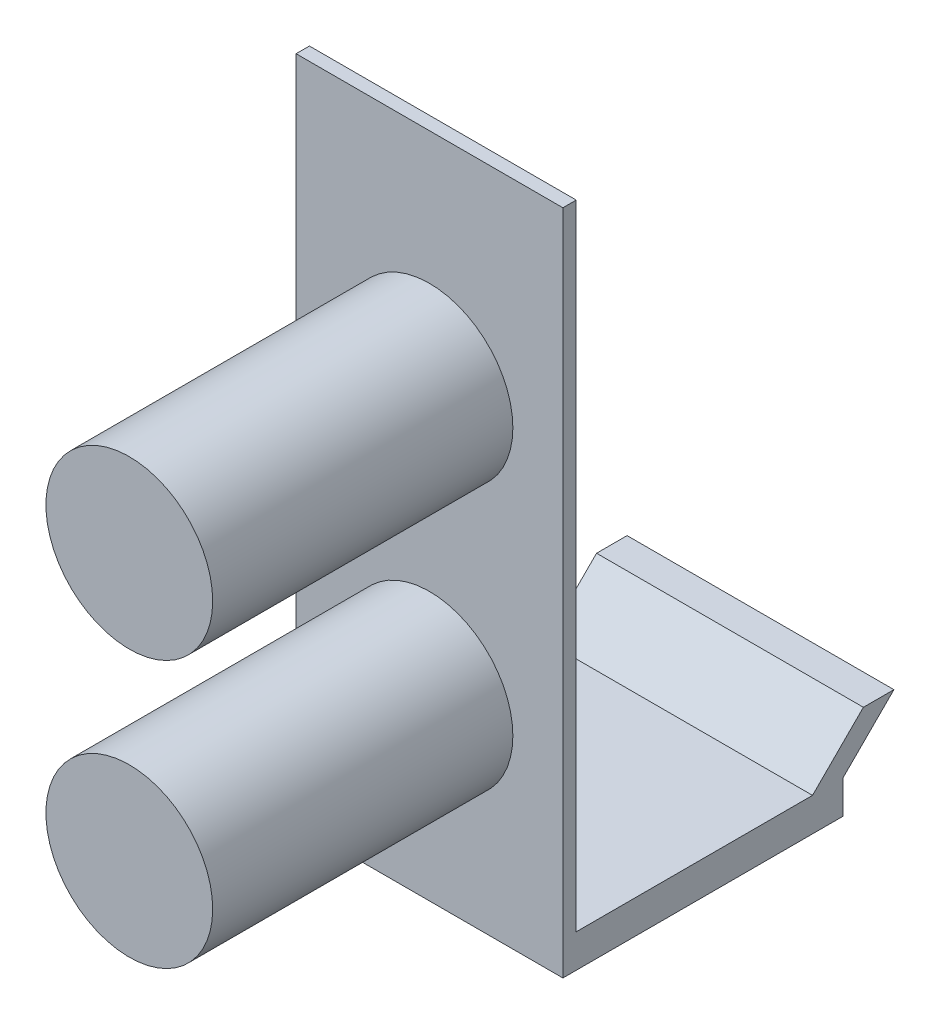
ISO-10303-21;
HEADER;
FILE_DESCRIPTION(('STEP AP214'),'2;1');
FILE_NAME('part.step','',(''),(''),'','','');
FILE_SCHEMA(('AUTOMOTIVE_DESIGN { 1 0 10303 214 1 1 1 1 }'));
ENDSEC;
DATA;
#1=APPLICATION_CONTEXT('core data for automotive mechanical design processes');
#2=APPLICATION_PROTOCOL_DEFINITION('international standard','automotive_design',2000,#1);
#3=PRODUCT_CONTEXT('',#1,'mechanical');
#4=PRODUCT('Part','Part','',(#3));
#5=PRODUCT_RELATED_PRODUCT_CATEGORY('part','',(#4));
#6=PRODUCT_DEFINITION_FORMATION('','',#4);
#7=PRODUCT_DEFINITION_CONTEXT('part definition',#1,'design');
#8=PRODUCT_DEFINITION('design','',#6,#7);
#9=PRODUCT_DEFINITION_SHAPE('','',#8);
#10=(LENGTH_UNIT() NAMED_UNIT(*) SI_UNIT(.MILLI.,.METRE.));
#11=(NAMED_UNIT(*) PLANE_ANGLE_UNIT() SI_UNIT($,.RADIAN.));
#12=(NAMED_UNIT(*) SI_UNIT($,.STERADIAN.) SOLID_ANGLE_UNIT());
#13=UNCERTAINTY_MEASURE_WITH_UNIT(LENGTH_MEASURE(1.E-05),#10,'distance_accuracy_value','');
#14=(GEOMETRIC_REPRESENTATION_CONTEXT(3) GLOBAL_UNCERTAINTY_ASSIGNED_CONTEXT((#13)) GLOBAL_UNIT_ASSIGNED_CONTEXT((#10,
#11,#12)) REPRESENTATION_CONTEXT('',''));
#15=CARTESIAN_POINT('',(0.,0.,0.));
#16=DIRECTION('',(0.,0.,1.));
#17=DIRECTION('',(1.,0.,0.));
#18=AXIS2_PLACEMENT_3D('',#15,#16,#17);
#19=CARTESIAN_POINT('',(0.,0.,0.));
#20=DIRECTION('',(0.,0.,1.));
#21=DIRECTION('',(1.,0.,0.));
#22=AXIS2_PLACEMENT_3D('',#19,#20,#21);
#23=PLANE('',#22);
#24=DIRECTION('',(1.,0.,0.));
#25=VECTOR('',#24,1.);
#26=CARTESIAN_POINT('',(25.4,-57.15,0.));
#27=LINE('',#26,#25);
#28=CARTESIAN_POINT('',(-25.4,-57.15,0.));
#29=VERTEX_POINT('',#28);
#30=CARTESIAN_POINT('',(25.4,-57.15,0.));
#31=VERTEX_POINT('',#30);
#32=EDGE_CURVE('E157',#29,#31,#27,.T.);
#33=ORIENTED_EDGE('',*,*,#32,.F.);
#34=DIRECTION('',(0.,-1.,0.));
#35=VECTOR('',#34,1.);
#36=CARTESIAN_POINT('',(-25.4,63.5,0.));
#37=LINE('',#36,#35);
#38=CARTESIAN_POINT('',(-25.4,63.5,0.));
#39=VERTEX_POINT('',#38);
#40=EDGE_CURVE('E199',#39,#29,#37,.T.);
#41=ORIENTED_EDGE('',*,*,#40,.F.);
#42=DIRECTION('',(-1.,0.,0.));
#43=VECTOR('',#42,1.);
#44=CARTESIAN_POINT('',(-25.4,63.5,0.));
#45=LINE('',#44,#43);
#46=CARTESIAN_POINT('',(25.4,63.5,0.));
#47=VERTEX_POINT('',#46);
#48=EDGE_CURVE('E79',#47,#39,#45,.T.);
#49=ORIENTED_EDGE('',*,*,#48,.F.);
#50=DIRECTION('',(0.,1.,0.));
#51=VECTOR('',#50,1.);
#52=CARTESIAN_POINT('',(25.4,63.5,0.));
#53=LINE('',#52,#51);
#54=EDGE_CURVE('E191',#31,#47,#53,.T.);
#55=ORIENTED_EDGE('',*,*,#54,.F.);
#56=EDGE_LOOP('',(#33,#41,#49,#55));
#57=FACE_BOUND('',#56,.T.);
#58=ADVANCED_FACE('F39',(#57),#23,.F.);
#59=CARTESIAN_POINT('',(25.4,63.5,2.54));
#60=DIRECTION('',(-1.,0.,0.));
#61=DIRECTION('',(0.,-1.,0.));
#62=AXIS2_PLACEMENT_3D('',#59,#60,#61);
#63=PLANE('',#62);
#64=DIRECTION('',(0.,-1.,0.));
#65=VECTOR('',#64,1.);
#66=CARTESIAN_POINT('',(25.4,-57.15,-50.8));
#67=LINE('',#66,#65);
#68=CARTESIAN_POINT('',(25.4,-57.15,-50.8));
#69=VERTEX_POINT('',#68);
#70=CARTESIAN_POINT('',(25.4,-63.5,-50.8));
#71=VERTEX_POINT('',#70);
#72=EDGE_CURVE('E127',#69,#71,#67,.T.);
#73=ORIENTED_EDGE('',*,*,#72,.F.);
#74=DIRECTION('',(0.,0.707106781186551,-0.707106781186544));
#75=VECTOR('',#74,1.);
#76=CARTESIAN_POINT('',(25.4,-63.5,-44.4500000000001));
#77=LINE('',#76,#75);
#78=CARTESIAN_POINT('',(25.4,-47.4678821923336,-60.4821178076663));
#79=VERTEX_POINT('',#78);
#80=EDGE_CURVE('E120',#69,#79,#77,.T.);
#81=ORIENTED_EDGE('',*,*,#80,.T.);
#82=DIRECTION('',(0.,0.,1.));
#83=VECTOR('',#82,1.);
#84=CARTESIAN_POINT('',(25.4,-47.4678821923336,-60.4821178076663));
#85=LINE('',#84,#83);
#86=CARTESIAN_POINT('',(25.4,-47.4678821923336,-54.6677736900544));
#87=VERTEX_POINT('',#86);
#88=EDGE_CURVE('E124',#79,#87,#85,.T.);
#89=ORIENTED_EDGE('',*,*,#88,.T.);
#90=DIRECTION('',(0.,-0.707106781186551,0.707106781186544));
#91=VECTOR('',#90,1.);
#92=CARTESIAN_POINT('',(25.4,-63.5,-38.6356558823882));
#93=LINE('',#92,#91);
#94=CARTESIAN_POINT('',(25.4,-57.15,-44.9856558823881));
#95=VERTEX_POINT('',#94);
#96=EDGE_CURVE('E142',#87,#95,#93,.T.);
#97=ORIENTED_EDGE('',*,*,#96,.T.);
#98=DIRECTION('',(0.,0.,1.));
#99=VECTOR('',#98,1.);
#100=CARTESIAN_POINT('',(25.4,-57.15,-50.8));
#101=LINE('',#100,#99);
#102=EDGE_CURVE('E172',#95,#31,#101,.T.);
#103=ORIENTED_EDGE('',*,*,#102,.T.);
#104=ORIENTED_EDGE('',*,*,#54,.T.);
#105=DIRECTION('',(0.,0.,-1.));
#106=VECTOR('',#105,1.);
#107=CARTESIAN_POINT('',(25.4,63.5,2.54));
#108=LINE('',#107,#106);
#109=CARTESIAN_POINT('',(25.4,63.5,2.54));
#110=VERTEX_POINT('',#109);
#111=EDGE_CURVE('E195',#110,#47,#108,.T.);
#112=ORIENTED_EDGE('',*,*,#111,.F.);
#113=DIRECTION('',(0.,1.,0.));
#114=VECTOR('',#113,1.);
#115=CARTESIAN_POINT('',(25.4,63.5,2.54));
#116=LINE('',#115,#114);
#117=CARTESIAN_POINT('',(25.4,-63.5,2.54));
#118=VERTEX_POINT('',#117);
#119=EDGE_CURVE('E196',#118,#110,#116,.T.);
#120=ORIENTED_EDGE('',*,*,#119,.F.);
#121=DIRECTION('',(0.,0.,-1.));
#122=VECTOR('',#121,1.);
#123=CARTESIAN_POINT('',(25.4,-63.5,2.54));
#124=LINE('',#123,#122);
#125=EDGE_CURVE('E207',#118,#71,#124,.T.);
#126=ORIENTED_EDGE('',*,*,#125,.T.);
#127=EDGE_LOOP('',(#73,#81,#89,#97,#103,#104,#112,#120,#126));
#128=FACE_BOUND('',#127,.T.);
#129=ADVANCED_FACE('F41',(#128),#63,.F.);
#130=CARTESIAN_POINT('',(-25.4,63.5,2.54));
#131=DIRECTION('',(0.,-1.,0.));
#132=DIRECTION('',(0.,0.,-1.));
#133=AXIS2_PLACEMENT_3D('',#130,#131,#132);
#134=PLANE('',#133);
#135=ORIENTED_EDGE('',*,*,#48,.T.);
#136=DIRECTION('',(0.,0.,-1.));
#137=VECTOR('',#136,1.);
#138=CARTESIAN_POINT('',(-25.4,63.5,2.54));
#139=LINE('',#138,#137);
#140=CARTESIAN_POINT('',(-25.4,63.5,2.54));
#141=VERTEX_POINT('',#140);
#142=EDGE_CURVE('E220',#141,#39,#139,.T.);
#143=ORIENTED_EDGE('',*,*,#142,.F.);
#144=DIRECTION('',(-1.,0.,0.));
#145=VECTOR('',#144,1.);
#146=CARTESIAN_POINT('',(-25.4,63.5,2.54));
#147=LINE('',#146,#145);
#148=EDGE_CURVE('E84',#110,#141,#147,.T.);
#149=ORIENTED_EDGE('',*,*,#148,.F.);
#150=ORIENTED_EDGE('',*,*,#111,.T.);
#151=EDGE_LOOP('',(#135,#143,#149,#150));
#152=FACE_BOUND('',#151,.T.);
#153=ADVANCED_FACE('F224',(#152),#134,.F.);
#154=CARTESIAN_POINT('',(-25.4,63.5,2.54));
#155=DIRECTION('',(1.,0.,0.));
#156=DIRECTION('',(0.,1.,0.));
#157=AXIS2_PLACEMENT_3D('',#154,#155,#156);
#158=PLANE('',#157);
#159=DIRECTION('',(0.,1.,0.));
#160=VECTOR('',#159,1.);
#161=CARTESIAN_POINT('',(-25.4,-57.15,-50.8));
#162=LINE('',#161,#160);
#163=CARTESIAN_POINT('',(-25.4,-63.5,-50.8));
#164=VERTEX_POINT('',#163);
#165=CARTESIAN_POINT('',(-25.4,-57.1500000000001,-50.8));
#166=VERTEX_POINT('',#165);
#167=EDGE_CURVE('E159',#164,#166,#162,.T.);
#168=ORIENTED_EDGE('',*,*,#167,.F.);
#169=DIRECTION('',(0.,0.,-1.));
#170=VECTOR('',#169,1.);
#171=CARTESIAN_POINT('',(-25.4,-63.5,2.54));
#172=LINE('',#171,#170);
#173=CARTESIAN_POINT('',(-25.4,-63.5,2.54));
#174=VERTEX_POINT('',#173);
#175=EDGE_CURVE('E217',#174,#164,#172,.T.);
#176=ORIENTED_EDGE('',*,*,#175,.F.);
#177=DIRECTION('',(0.,-1.,0.));
#178=VECTOR('',#177,1.);
#179=CARTESIAN_POINT('',(-25.4,63.5,2.54));
#180=LINE('',#179,#178);
#181=EDGE_CURVE('E202',#141,#174,#180,.T.);
#182=ORIENTED_EDGE('',*,*,#181,.F.);
#183=ORIENTED_EDGE('',*,*,#142,.T.);
#184=ORIENTED_EDGE('',*,*,#40,.T.);
#185=DIRECTION('',(0.,0.,1.));
#186=VECTOR('',#185,1.);
#187=CARTESIAN_POINT('',(-25.4,-57.15,-50.8));
#188=LINE('',#187,#186);
#189=CARTESIAN_POINT('',(-25.4,-57.15,-44.9856558823882));
#190=VERTEX_POINT('',#189);
#191=EDGE_CURVE('E54',#190,#29,#188,.T.);
#192=ORIENTED_EDGE('',*,*,#191,.F.);
#193=DIRECTION('',(0.,0.707106781186551,-0.707106781186544));
#194=VECTOR('',#193,1.);
#195=CARTESIAN_POINT('',(-25.4,-63.5,-38.6356558823882));
#196=LINE('',#195,#194);
#197=CARTESIAN_POINT('',(-25.4,-47.4678821923336,-54.6677736900544));
#198=VERTEX_POINT('',#197);
#199=EDGE_CURVE('E158',#190,#198,#196,.T.);
#200=ORIENTED_EDGE('',*,*,#199,.T.);
#201=DIRECTION('',(0.,0.,-1.));
#202=VECTOR('',#201,1.);
#203=CARTESIAN_POINT('',(-25.4,-47.4678821923336,-60.4821178076663));
#204=LINE('',#203,#202);
#205=CARTESIAN_POINT('',(-25.4,-47.4678821923336,-60.4821178076663));
#206=VERTEX_POINT('',#205);
#207=EDGE_CURVE('E153',#198,#206,#204,.T.);
#208=ORIENTED_EDGE('',*,*,#207,.T.);
#209=DIRECTION('',(0.,-0.707106781186551,0.707106781186544));
#210=VECTOR('',#209,1.);
#211=CARTESIAN_POINT('',(-25.4,-63.5,-44.4500000000001));
#212=LINE('',#211,#210);
#213=EDGE_CURVE('E137',#206,#166,#212,.T.);
#214=ORIENTED_EDGE('',*,*,#213,.T.);
#215=EDGE_LOOP('',(#168,#176,#182,#183,#184,#192,#200,#208,#214));
#216=FACE_BOUND('',#215,.T.);
#217=ADVANCED_FACE('F232',(#216),#158,.F.);
#218=CARTESIAN_POINT('',(-25.4,-63.5,2.54));
#219=DIRECTION('',(0.,1.,0.));
#220=DIRECTION('',(0.,0.,1.));
#221=AXIS2_PLACEMENT_3D('',#218,#219,#220);
#222=PLANE('',#221);
#223=DIRECTION('',(-1.,0.,0.));
#224=VECTOR('',#223,1.);
#225=CARTESIAN_POINT('',(25.4,-63.5,-50.8));
#226=LINE('',#225,#224);
#227=EDGE_CURVE('E168',#71,#164,#226,.T.);
#228=ORIENTED_EDGE('',*,*,#227,.F.);
#229=ORIENTED_EDGE('',*,*,#125,.F.);
#230=DIRECTION('',(1.,0.,0.));
#231=VECTOR('',#230,1.);
#232=CARTESIAN_POINT('',(-25.4,-63.5,2.54));
#233=LINE('',#232,#231);
#234=EDGE_CURVE('E63',#174,#118,#233,.T.);
#235=ORIENTED_EDGE('',*,*,#234,.F.);
#236=ORIENTED_EDGE('',*,*,#175,.T.);
#237=EDGE_LOOP('',(#228,#229,#235,#236));
#238=FACE_BOUND('',#237,.T.);
#239=ADVANCED_FACE('F238',(#238),#222,.F.);
#240=CARTESIAN_POINT('',(0.,0.,2.54));
#241=DIRECTION('',(0.,0.,1.));
#242=DIRECTION('',(1.,0.,0.));
#243=AXIS2_PLACEMENT_3D('',#240,#241,#242);
#244=PLANE('',#243);
#245=CARTESIAN_POINT('',(0.,-28.3344838125978,2.54));
#246=DIRECTION('',(0.,0.,1.));
#247=DIRECTION('',(1.,0.,0.));
#248=AXIS2_PLACEMENT_3D('',#245,#246,#247);
#249=CIRCLE('',#248,15.875);
#250=CARTESIAN_POINT('',(15.875,-28.3344838125978,2.54));
#251=VERTEX_POINT('',#250);
#252=EDGE_CURVE('E179',#251,#251,#249,.T.);
#253=ORIENTED_EDGE('',*,*,#252,.F.);
#254=EDGE_LOOP('',(#253));
#255=FACE_BOUND('',#254,.T.);
#256=CARTESIAN_POINT('',(0.,22.4655161874022,2.54));
#257=DIRECTION('',(0.,0.,1.));
#258=DIRECTION('',(1.,0.,0.));
#259=AXIS2_PLACEMENT_3D('',#256,#257,#258);
#260=CIRCLE('',#259,15.875);
#261=CARTESIAN_POINT('',(15.875,22.4655161874022,2.54));
#262=VERTEX_POINT('',#261);
#263=EDGE_CURVE('E48',#262,#262,#260,.T.);
#264=ORIENTED_EDGE('',*,*,#263,.F.);
#265=EDGE_LOOP('',(#264));
#266=FACE_BOUND('',#265,.T.);
#267=ORIENTED_EDGE('',*,*,#119,.T.);
#268=ORIENTED_EDGE('',*,*,#148,.T.);
#269=ORIENTED_EDGE('',*,*,#181,.T.);
#270=ORIENTED_EDGE('',*,*,#234,.T.);
#271=EDGE_LOOP('',(#267,#268,#269,#270));
#272=FACE_BOUND('',#271,.T.);
#273=ADVANCED_FACE('F235',(#255,#266,#272),#244,.T.);
#274=CARTESIAN_POINT('',(0.,22.4655161874022,59.69));
#275=DIRECTION('',(0.,0.,-1.));
#276=DIRECTION('',(-1.,0.,0.));
#277=AXIS2_PLACEMENT_3D('',#274,#275,#276);
#278=CYLINDRICAL_SURFACE('',#277,15.875);
#279=CARTESIAN_POINT('',(0.,22.4655161874022,59.69));
#280=DIRECTION('',(0.,0.,1.));
#281=DIRECTION('',(1.,0.,0.));
#282=AXIS2_PLACEMENT_3D('',#279,#280,#281);
#283=CIRCLE('',#282,15.875);
#284=CARTESIAN_POINT('',(15.875,22.4655161874022,59.69));
#285=VERTEX_POINT('',#284);
#286=EDGE_CURVE('E184',#285,#285,#283,.T.);
#287=ORIENTED_EDGE('',*,*,#286,.F.);
#288=EDGE_LOOP('',(#287));
#289=FACE_BOUND('',#288,.T.);
#290=ORIENTED_EDGE('',*,*,#263,.T.);
#291=EDGE_LOOP('',(#290));
#292=FACE_BOUND('',#291,.T.);
#293=ADVANCED_FACE('F237',(#289,#292),#278,.T.);
#294=CARTESIAN_POINT('',(0.,22.4655161874022,59.69));
#295=DIRECTION('',(0.,0.,1.));
#296=DIRECTION('',(1.,0.,0.));
#297=AXIS2_PLACEMENT_3D('',#294,#295,#296);
#298=PLANE('',#297);
#299=ORIENTED_EDGE('',*,*,#286,.T.);
#300=EDGE_LOOP('',(#299));
#301=FACE_BOUND('',#300,.T.);
#302=ADVANCED_FACE('F245',(#301),#298,.T.);
#303=CARTESIAN_POINT('',(0.,-28.3344838125978,59.69));
#304=DIRECTION('',(0.,0.,-1.));
#305=DIRECTION('',(-1.,0.,0.));
#306=AXIS2_PLACEMENT_3D('',#303,#304,#305);
#307=CYLINDRICAL_SURFACE('',#306,15.875);
#308=CARTESIAN_POINT('',(0.,-28.3344838125978,59.69));
#309=DIRECTION('',(0.,0.,1.));
#310=DIRECTION('',(1.,0.,0.));
#311=AXIS2_PLACEMENT_3D('',#308,#309,#310);
#312=CIRCLE('',#311,15.875);
#313=CARTESIAN_POINT('',(15.875,-28.3344838125978,59.69));
#314=VERTEX_POINT('',#313);
#315=EDGE_CURVE('E180',#314,#314,#312,.T.);
#316=ORIENTED_EDGE('',*,*,#315,.F.);
#317=EDGE_LOOP('',(#316));
#318=FACE_BOUND('',#317,.T.);
#319=ORIENTED_EDGE('',*,*,#252,.T.);
#320=EDGE_LOOP('',(#319));
#321=FACE_BOUND('',#320,.T.);
#322=ADVANCED_FACE('F328',(#318,#321),#307,.T.);
#323=CARTESIAN_POINT('',(0.,-28.3344838125978,59.69));
#324=DIRECTION('',(0.,0.,1.));
#325=DIRECTION('',(1.,0.,0.));
#326=AXIS2_PLACEMENT_3D('',#323,#324,#325);
#327=PLANE('',#326);
#328=ORIENTED_EDGE('',*,*,#315,.T.);
#329=EDGE_LOOP('',(#328));
#330=FACE_BOUND('',#329,.T.);
#331=ADVANCED_FACE('F285',(#330),#327,.T.);
#332=CARTESIAN_POINT('',(25.4,-57.15,-50.8));
#333=DIRECTION('',(0.,-1.,0.));
#334=DIRECTION('',(0.,0.,-1.));
#335=AXIS2_PLACEMENT_3D('',#332,#333,#334);
#336=PLANE('',#335);
#337=ORIENTED_EDGE('',*,*,#102,.F.);
#338=DIRECTION('',(-1.,0.,0.));
#339=VECTOR('',#338,1.);
#340=CARTESIAN_POINT('',(25.4,-57.15,-44.9856558823882));
#341=LINE('',#340,#339);
#342=EDGE_CURVE('E11',#95,#190,#341,.T.);
#343=ORIENTED_EDGE('',*,*,#342,.T.);
#344=ORIENTED_EDGE('',*,*,#191,.T.);
#345=ORIENTED_EDGE('',*,*,#32,.T.);
#346=EDGE_LOOP('',(#337,#343,#344,#345));
#347=FACE_BOUND('',#346,.T.);
#348=ADVANCED_FACE('F280',(#347),#336,.F.);
#349=CARTESIAN_POINT('',(0.,0.,-50.8));
#350=DIRECTION('',(0.,0.,-1.));
#351=DIRECTION('',(-1.,0.,0.));
#352=AXIS2_PLACEMENT_3D('',#349,#350,#351);
#353=PLANE('',#352);
#354=ORIENTED_EDGE('',*,*,#167,.T.);
#355=DIRECTION('',(1.,0.,0.));
#356=VECTOR('',#355,1.);
#357=CARTESIAN_POINT('',(25.4,-57.15,-50.8));
#358=LINE('',#357,#356);
#359=EDGE_CURVE('E163',#166,#69,#358,.T.);
#360=ORIENTED_EDGE('',*,*,#359,.T.);
#361=ORIENTED_EDGE('',*,*,#72,.T.);
#362=ORIENTED_EDGE('',*,*,#227,.T.);
#363=EDGE_LOOP('',(#354,#360,#361,#362));
#364=FACE_BOUND('',#363,.T.);
#365=ADVANCED_FACE('F284',(#364),#353,.T.);
#366=CARTESIAN_POINT('',(-52.4979095144167,-63.5,-38.6356558823882));
#367=DIRECTION('',(0.,0.707106781186544,0.707106781186551));
#368=DIRECTION('',(0.,-0.707106781186551,0.707106781186544));
#369=AXIS2_PLACEMENT_3D('',#366,#367,#368);
#370=PLANE('',#369);
#371=ORIENTED_EDGE('',*,*,#342,.F.);
#372=ORIENTED_EDGE('',*,*,#96,.F.);
#373=DIRECTION('',(1.,0.,0.));
#374=VECTOR('',#373,1.);
#375=CARTESIAN_POINT('',(-52.4979095144168,-47.4678821923336,-54.6677736900544));
#376=LINE('',#375,#374);
#377=EDGE_CURVE('E141',#198,#87,#376,.T.);
#378=ORIENTED_EDGE('',*,*,#377,.F.);
#379=ORIENTED_EDGE('',*,*,#199,.F.);
#380=EDGE_LOOP('',(#371,#372,#378,#379));
#381=FACE_BOUND('',#380,.T.);
#382=ADVANCED_FACE('F295',(#381),#370,.T.);
#383=CARTESIAN_POINT('',(-52.4979095144168,-47.4678821923336,-60.4821178076663));
#384=DIRECTION('',(0.,1.,0.));
#385=DIRECTION('',(0.,0.,1.));
#386=AXIS2_PLACEMENT_3D('',#383,#384,#385);
#387=PLANE('',#386);
#388=ORIENTED_EDGE('',*,*,#207,.F.);
#389=ORIENTED_EDGE('',*,*,#377,.T.);
#390=ORIENTED_EDGE('',*,*,#88,.F.);
#391=DIRECTION('',(1.,0.,0.));
#392=VECTOR('',#391,1.);
#393=CARTESIAN_POINT('',(-52.4979095144168,-47.4678821923336,-60.4821178076663));
#394=LINE('',#393,#392);
#395=EDGE_CURVE('E134',#206,#79,#394,.T.);
#396=ORIENTED_EDGE('',*,*,#395,.F.);
#397=EDGE_LOOP('',(#388,#389,#390,#396));
#398=FACE_BOUND('',#397,.T.);
#399=ADVANCED_FACE('F144',(#398),#387,.T.);
#400=CARTESIAN_POINT('',(-52.4979095144167,-63.5,-44.4500000000001));
#401=DIRECTION('',(0.,-0.707106781186544,-0.707106781186551));
#402=DIRECTION('',(0.,0.707106781186551,-0.707106781186544));
#403=AXIS2_PLACEMENT_3D('',#400,#401,#402);
#404=PLANE('',#403);
#405=ORIENTED_EDGE('',*,*,#80,.F.);
#406=ORIENTED_EDGE('',*,*,#359,.F.);
#407=ORIENTED_EDGE('',*,*,#213,.F.);
#408=ORIENTED_EDGE('',*,*,#395,.T.);
#409=EDGE_LOOP('',(#405,#406,#407,#408));
#410=FACE_BOUND('',#409,.T.);
#411=ADVANCED_FACE('F135',(#410),#404,.T.);
#412=CLOSED_SHELL('',(#58,#129,#153,#217,#239,#273,#293,#302,#322,#331,#348,#365,#382,#399,#411));
#413=MANIFOLD_SOLID_BREP('B2',#412);
#414=ADVANCED_BREP_SHAPE_REPRESENTATION('',(#18,#413),#14);
#415=SHAPE_DEFINITION_REPRESENTATION(#9,#414);
ENDSEC;
END-ISO-10303-21;
